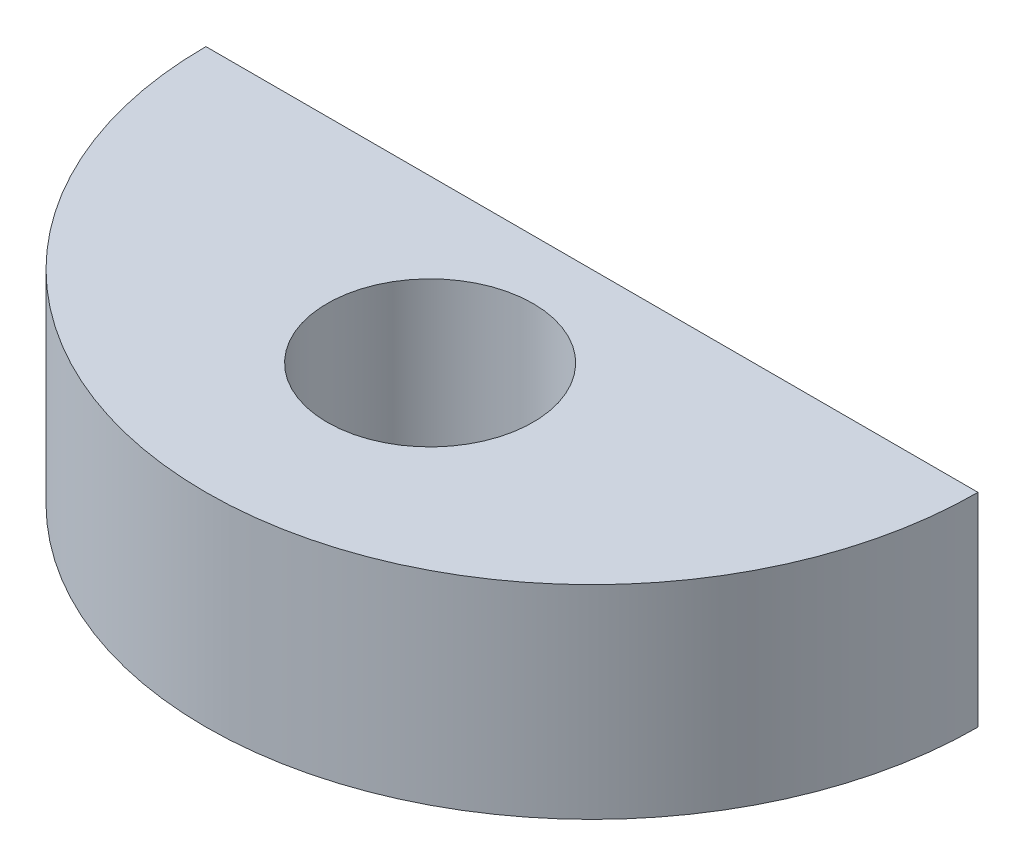
ISO-10303-21;
HEADER;
FILE_DESCRIPTION(('STEP AP214'),'2;1');
FILE_NAME('part.step','',(''),(''),'','','');
FILE_SCHEMA(('AUTOMOTIVE_DESIGN { 1 0 10303 214 1 1 1 1 }'));
ENDSEC;
DATA;
#1=APPLICATION_CONTEXT('core data for automotive mechanical design processes');
#2=APPLICATION_PROTOCOL_DEFINITION('international standard','automotive_design',2000,#1);
#3=PRODUCT_CONTEXT('',#1,'mechanical');
#4=PRODUCT('Part','Part','',(#3));
#5=PRODUCT_RELATED_PRODUCT_CATEGORY('part','',(#4));
#6=PRODUCT_DEFINITION_FORMATION('','',#4);
#7=PRODUCT_DEFINITION_CONTEXT('part definition',#1,'design');
#8=PRODUCT_DEFINITION('design','',#6,#7);
#9=PRODUCT_DEFINITION_SHAPE('','',#8);
#10=(LENGTH_UNIT() NAMED_UNIT(*) SI_UNIT(.MILLI.,.METRE.));
#11=(NAMED_UNIT(*) PLANE_ANGLE_UNIT() SI_UNIT($,.RADIAN.));
#12=(NAMED_UNIT(*) SI_UNIT($,.STERADIAN.) SOLID_ANGLE_UNIT());
#13=UNCERTAINTY_MEASURE_WITH_UNIT(LENGTH_MEASURE(1.E-05),#10,'distance_accuracy_value','');
#14=(GEOMETRIC_REPRESENTATION_CONTEXT(3) GLOBAL_UNCERTAINTY_ASSIGNED_CONTEXT((#13)) GLOBAL_UNIT_ASSIGNED_CONTEXT((#10,
#11,#12)) REPRESENTATION_CONTEXT('',''));
#15=CARTESIAN_POINT('',(0.,0.,0.));
#16=DIRECTION('',(0.,0.,1.));
#17=DIRECTION('',(1.,0.,0.));
#18=AXIS2_PLACEMENT_3D('',#15,#16,#17);
#19=CARTESIAN_POINT('',(7.00656999372255,20.066,-25.6970495919648));
#20=DIRECTION('',(0.,1.,0.));
#21=DIRECTION('',(0.,0.,1.));
#22=AXIS2_PLACEMENT_3D('',#19,#20,#21);
#23=PLANE('',#22);
#24=CARTESIAN_POINT('',(7.00656999372255,20.066,-25.6970495919648));
#25=DIRECTION('',(0.,1.,0.));
#26=DIRECTION('',(0.,0.,1.));
#27=AXIS2_PLACEMENT_3D('',#24,#25,#26);
#28=CIRCLE('',#27,38.1);
#29=CARTESIAN_POINT('',(-31.0934300062775,20.066,-25.6970495919648));
#30=VERTEX_POINT('',#29);
#31=CARTESIAN_POINT('',(45.1065699937225,20.066,-25.6970495919648));
#32=VERTEX_POINT('',#31);
#33=EDGE_CURVE('E72',#30,#32,#28,.T.);
#34=ORIENTED_EDGE('',*,*,#33,.T.);
#35=DIRECTION('',(-1.,0.,0.));
#36=VECTOR('',#35,1.);
#37=CARTESIAN_POINT('',(-31.0934300062775,20.066,-25.6970495919648));
#38=LINE('',#37,#36);
#39=EDGE_CURVE('E56',#32,#30,#38,.T.);
#40=ORIENTED_EDGE('',*,*,#39,.T.);
#41=EDGE_LOOP('',(#34,#40));
#42=FACE_BOUND('',#41,.T.);
#43=CARTESIAN_POINT('',(7.00656999372255,20.066,-9.72480313445662));
#44=DIRECTION('',(0.,1.,0.));
#45=DIRECTION('',(0.,0.,1.));
#46=AXIS2_PLACEMENT_3D('',#43,#44,#45);
#47=CIRCLE('',#46,10.16);
#48=CARTESIAN_POINT('',(7.00656999372255,20.066,0.435196865543379));
#49=VERTEX_POINT('',#48);
#50=EDGE_CURVE('E80',#49,#49,#47,.T.);
#51=ORIENTED_EDGE('',*,*,#50,.F.);
#52=EDGE_LOOP('',(#51));
#53=FACE_BOUND('',#52,.T.);
#54=ADVANCED_FACE('F39',(#42,#53),#23,.T.);
#55=CARTESIAN_POINT('',(7.00656999372255,0.,-25.6970495919648));
#56=DIRECTION('',(0.,1.,0.));
#57=DIRECTION('',(0.,0.,1.));
#58=AXIS2_PLACEMENT_3D('',#55,#56,#57);
#59=PLANE('',#58);
#60=CARTESIAN_POINT('',(7.00656999372255,0.,-25.6970495919648));
#61=DIRECTION('',(0.,1.,0.));
#62=DIRECTION('',(0.,0.,1.));
#63=AXIS2_PLACEMENT_3D('',#60,#61,#62);
#64=CIRCLE('',#63,38.1);
#65=CARTESIAN_POINT('',(-31.0934300062775,0.,-25.6970495919648));
#66=VERTEX_POINT('',#65);
#67=CARTESIAN_POINT('',(45.1065699937225,0.,-25.6970495919648));
#68=VERTEX_POINT('',#67);
#69=EDGE_CURVE('E73',#66,#68,#64,.T.);
#70=ORIENTED_EDGE('',*,*,#69,.F.);
#71=DIRECTION('',(-1.,0.,0.));
#72=VECTOR('',#71,1.);
#73=CARTESIAN_POINT('',(-31.0934300062775,0.,-25.6970495919648));
#74=LINE('',#73,#72);
#75=EDGE_CURVE('E64',#68,#66,#74,.T.);
#76=ORIENTED_EDGE('',*,*,#75,.F.);
#77=EDGE_LOOP('',(#70,#76));
#78=FACE_BOUND('',#77,.T.);
#79=CARTESIAN_POINT('',(7.00656999372255,0.,-9.72480313445662));
#80=DIRECTION('',(0.,1.,0.));
#81=DIRECTION('',(0.,0.,1.));
#82=AXIS2_PLACEMENT_3D('',#79,#80,#81);
#83=CIRCLE('',#82,10.16);
#84=CARTESIAN_POINT('',(7.00656999372255,0.,0.435196865543379));
#85=VERTEX_POINT('',#84);
#86=EDGE_CURVE('E84',#85,#85,#83,.T.);
#87=ORIENTED_EDGE('',*,*,#86,.T.);
#88=EDGE_LOOP('',(#87));
#89=FACE_BOUND('',#88,.T.);
#90=ADVANCED_FACE('F77',(#78,#89),#59,.F.);
#91=CARTESIAN_POINT('',(7.00656999372255,20.066,-25.6970495919648));
#92=DIRECTION('',(0.,-1.,0.));
#93=DIRECTION('',(0.,0.,-1.));
#94=AXIS2_PLACEMENT_3D('',#91,#92,#93);
#95=CYLINDRICAL_SURFACE('',#94,38.1);
#96=ORIENTED_EDGE('',*,*,#69,.T.);
#97=DIRECTION('',(0.,-1.,0.));
#98=VECTOR('',#97,1.);
#99=CARTESIAN_POINT('',(45.1065699937225,20.066,-25.6970495919648));
#100=LINE('',#99,#98);
#101=EDGE_CURVE('E11',#32,#68,#100,.T.);
#102=ORIENTED_EDGE('',*,*,#101,.F.);
#103=ORIENTED_EDGE('',*,*,#33,.F.);
#104=DIRECTION('',(0.,-1.,0.));
#105=VECTOR('',#104,1.);
#106=CARTESIAN_POINT('',(-31.0934300062775,20.066,-25.6970495919648));
#107=LINE('',#106,#105);
#108=EDGE_CURVE('E49',#30,#66,#107,.T.);
#109=ORIENTED_EDGE('',*,*,#108,.T.);
#110=EDGE_LOOP('',(#96,#102,#103,#109));
#111=FACE_BOUND('',#110,.T.);
#112=ADVANCED_FACE('F41',(#111),#95,.T.);
#113=CARTESIAN_POINT('',(-31.0934300062775,20.066,-25.6970495919648));
#114=DIRECTION('',(0.,0.,1.));
#115=DIRECTION('',(1.,0.,0.));
#116=AXIS2_PLACEMENT_3D('',#113,#114,#115);
#117=PLANE('',#116);
#118=ORIENTED_EDGE('',*,*,#75,.T.);
#119=ORIENTED_EDGE('',*,*,#108,.F.);
#120=ORIENTED_EDGE('',*,*,#39,.F.);
#121=ORIENTED_EDGE('',*,*,#101,.T.);
#122=EDGE_LOOP('',(#118,#119,#120,#121));
#123=FACE_BOUND('',#122,.T.);
#124=ADVANCED_FACE('F67',(#123),#117,.F.);
#125=CARTESIAN_POINT('',(7.00656999372255,20.066,-9.72480313445662));
#126=DIRECTION('',(0.,-1.,0.));
#127=DIRECTION('',(0.,0.,-1.));
#128=AXIS2_PLACEMENT_3D('',#125,#126,#127);
#129=CYLINDRICAL_SURFACE('',#128,10.16);
#130=ORIENTED_EDGE('',*,*,#50,.T.);
#131=EDGE_LOOP('',(#130));
#132=FACE_BOUND('',#131,.T.);
#133=ORIENTED_EDGE('',*,*,#86,.F.);
#134=EDGE_LOOP('',(#133));
#135=FACE_BOUND('',#134,.T.);
#136=ADVANCED_FACE('F95',(#132,#135),#129,.F.);
#137=CLOSED_SHELL('',(#54,#90,#112,#124,#136));
#138=MANIFOLD_SOLID_BREP('B2',#137);
#139=ADVANCED_BREP_SHAPE_REPRESENTATION('',(#18,#138),#14);
#140=SHAPE_DEFINITION_REPRESENTATION(#9,#139);
ENDSEC;
END-ISO-10303-21;
